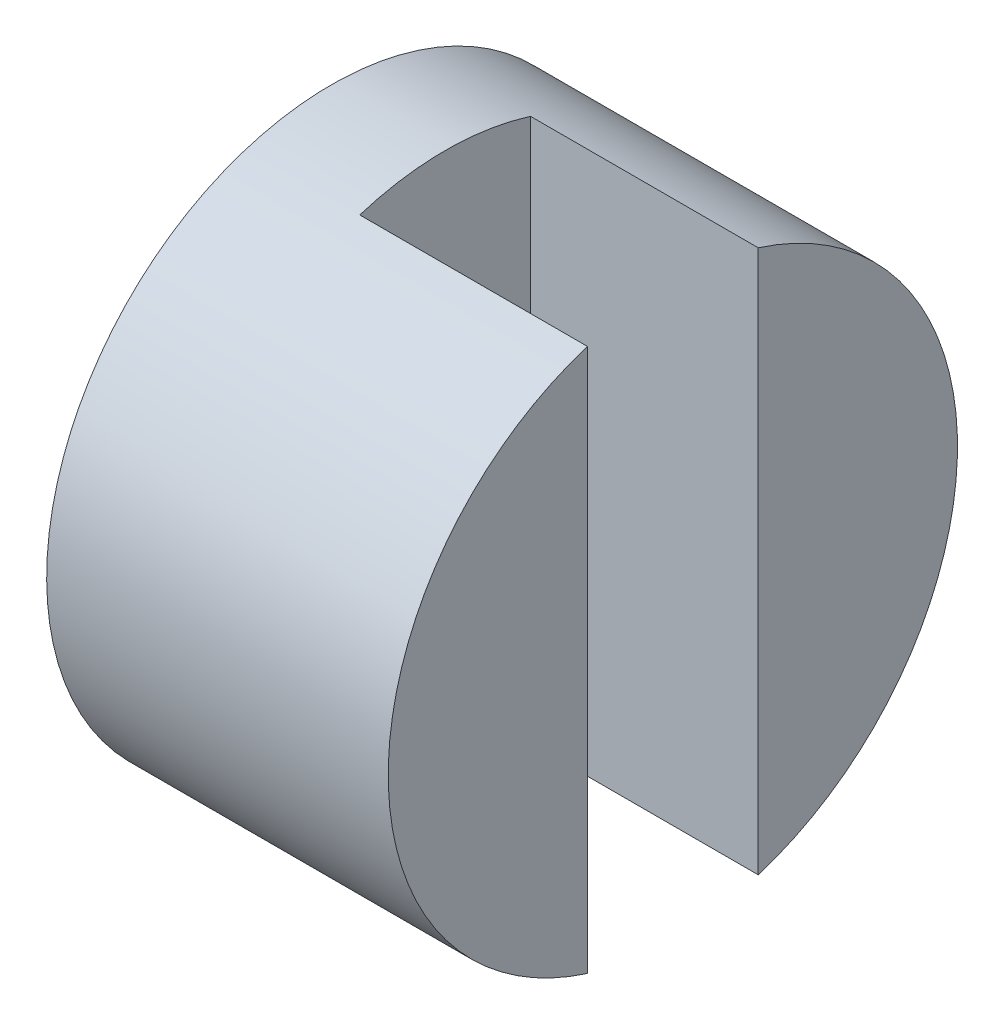
ISO-10303-21;
HEADER;
FILE_DESCRIPTION(('STEP AP214'),'2;1');
FILE_NAME('part.step','',(''),(''),'','','');
FILE_SCHEMA(('AUTOMOTIVE_DESIGN { 1 0 10303 214 1 1 1 1 }'));
ENDSEC;
DATA;
#1=APPLICATION_CONTEXT('core data for automotive mechanical design processes');
#2=APPLICATION_PROTOCOL_DEFINITION('international standard','automotive_design',2000,#1);
#3=PRODUCT_CONTEXT('',#1,'mechanical');
#4=PRODUCT('Part','Part','',(#3));
#5=PRODUCT_RELATED_PRODUCT_CATEGORY('part','',(#4));
#6=PRODUCT_DEFINITION_FORMATION('','',#4);
#7=PRODUCT_DEFINITION_CONTEXT('part definition',#1,'design');
#8=PRODUCT_DEFINITION('design','',#6,#7);
#9=PRODUCT_DEFINITION_SHAPE('','',#8);
#10=(LENGTH_UNIT() NAMED_UNIT(*) SI_UNIT(.MILLI.,.METRE.));
#11=(NAMED_UNIT(*) PLANE_ANGLE_UNIT() SI_UNIT($,.RADIAN.));
#12=(NAMED_UNIT(*) SI_UNIT($,.STERADIAN.) SOLID_ANGLE_UNIT());
#13=UNCERTAINTY_MEASURE_WITH_UNIT(LENGTH_MEASURE(1.E-05),#10,'distance_accuracy_value','');
#14=(GEOMETRIC_REPRESENTATION_CONTEXT(3) GLOBAL_UNCERTAINTY_ASSIGNED_CONTEXT((#13)) GLOBAL_UNIT_ASSIGNED_CONTEXT((#10,
#11,#12)) REPRESENTATION_CONTEXT('',''));
#15=CARTESIAN_POINT('',(0.,0.,0.));
#16=DIRECTION('',(0.,0.,1.));
#17=DIRECTION('',(1.,0.,0.));
#18=AXIS2_PLACEMENT_3D('',#15,#16,#17);
#19=CARTESIAN_POINT('',(6.,0.,0.));
#20=DIRECTION('',(1.,0.,0.));
#21=DIRECTION('',(0.,0.,-1.));
#22=AXIS2_PLACEMENT_3D('',#19,#20,#21);
#23=PLANE('',#22);
#24=DIRECTION('',(0.,1.,0.));
#25=VECTOR('',#24,1.);
#26=CARTESIAN_POINT('',(6.,4.76969600708473,-1.5));
#27=LINE('',#26,#25);
#28=CARTESIAN_POINT('',(6.,-4.76969600708473,-1.5));
#29=VERTEX_POINT('',#28);
#30=CARTESIAN_POINT('',(6.,4.76969600708473,-1.5));
#31=VERTEX_POINT('',#30);
#32=EDGE_CURVE('E72',#29,#31,#27,.T.);
#33=ORIENTED_EDGE('',*,*,#32,.F.);
#34=CARTESIAN_POINT('',(6.,0.,0.));
#35=DIRECTION('',(1.,0.,0.));
#36=DIRECTION('',(0.,0.,-1.));
#37=AXIS2_PLACEMENT_3D('',#34,#35,#36);
#38=CIRCLE('',#37,5.);
#39=EDGE_CURVE('E42',#29,#31,#38,.T.);
#40=ORIENTED_EDGE('',*,*,#39,.T.);
#41=EDGE_LOOP('',(#33,#40));
#42=FACE_BOUND('',#41,.T.);
#43=ADVANCED_FACE('F33',(#42),#23,.T.);
#44=CARTESIAN_POINT('',(6.,0.,0.));
#45=DIRECTION('',(-1.,0.,0.));
#46=DIRECTION('',(0.,0.,1.));
#47=AXIS2_PLACEMENT_3D('',#44,#45,#46);
#48=CYLINDRICAL_SURFACE('',#47,5.);
#49=CARTESIAN_POINT('',(2.,0.,0.));
#50=DIRECTION('',(1.,0.,0.));
#51=DIRECTION('',(0.,0.,-1.));
#52=AXIS2_PLACEMENT_3D('',#49,#50,#51);
#53=CIRCLE('',#52,5.);
#54=CARTESIAN_POINT('',(2.,4.76969600708473,-1.5));
#55=VERTEX_POINT('',#54);
#56=CARTESIAN_POINT('',(2.,4.76969600708473,1.5));
#57=VERTEX_POINT('',#56);
#58=EDGE_CURVE('E91',#55,#57,#53,.T.);
#59=ORIENTED_EDGE('',*,*,#58,.F.);
#60=DIRECTION('',(1.,0.,0.));
#61=VECTOR('',#60,1.);
#62=CARTESIAN_POINT('',(2.,4.76969600708473,-1.5));
#63=LINE('',#62,#61);
#64=EDGE_CURVE('E58',#55,#31,#63,.T.);
#65=ORIENTED_EDGE('',*,*,#64,.T.);
#66=ORIENTED_EDGE('',*,*,#39,.F.);
#67=DIRECTION('',(1.,0.,0.));
#68=VECTOR('',#67,1.);
#69=CARTESIAN_POINT('',(2.,-4.76969600708473,-1.5));
#70=LINE('',#69,#68);
#71=CARTESIAN_POINT('',(2.,-4.76969600708473,-1.5));
#72=VERTEX_POINT('',#71);
#73=EDGE_CURVE('E85',#72,#29,#70,.T.);
#74=ORIENTED_EDGE('',*,*,#73,.F.);
#75=CARTESIAN_POINT('',(2.,0.,0.));
#76=DIRECTION('',(1.,0.,0.));
#77=DIRECTION('',(0.,0.,-1.));
#78=AXIS2_PLACEMENT_3D('',#75,#76,#77);
#79=CIRCLE('',#78,5.);
#80=CARTESIAN_POINT('',(2.,-4.76969600708473,1.5));
#81=VERTEX_POINT('',#80);
#82=EDGE_CURVE('E89',#81,#72,#79,.T.);
#83=ORIENTED_EDGE('',*,*,#82,.F.);
#84=DIRECTION('',(1.,0.,0.));
#85=VECTOR('',#84,1.);
#86=CARTESIAN_POINT('',(2.,-4.76969600708473,1.5));
#87=LINE('',#86,#85);
#88=CARTESIAN_POINT('',(6.,-4.76969600708473,1.5));
#89=VERTEX_POINT('',#88);
#90=EDGE_CURVE('E79',#81,#89,#87,.T.);
#91=ORIENTED_EDGE('',*,*,#90,.T.);
#92=CARTESIAN_POINT('',(6.,4.76969600708473,1.5));
#93=VERTEX_POINT('',#92);
#94=EDGE_CURVE('E11',#93,#89,#38,.T.);
#95=ORIENTED_EDGE('',*,*,#94,.F.);
#96=DIRECTION('',(1.,0.,0.));
#97=VECTOR('',#96,1.);
#98=CARTESIAN_POINT('',(2.,4.76969600708473,1.5));
#99=LINE('',#98,#97);
#100=EDGE_CURVE('E49',#57,#93,#99,.T.);
#101=ORIENTED_EDGE('',*,*,#100,.F.);
#102=EDGE_LOOP('',(#59,#65,#66,#74,#83,#91,#95,#101));
#103=FACE_BOUND('',#102,.T.);
#104=CARTESIAN_POINT('',(0.,0.,0.));
#105=DIRECTION('',(1.,0.,0.));
#106=DIRECTION('',(0.,0.,-1.));
#107=AXIS2_PLACEMENT_3D('',#104,#105,#106);
#108=CIRCLE('',#107,5.);
#109=CARTESIAN_POINT('',(0.,0.,-5.));
#110=VERTEX_POINT('',#109);
#111=EDGE_CURVE('E37',#110,#110,#108,.T.);
#112=ORIENTED_EDGE('',*,*,#111,.T.);
#113=EDGE_LOOP('',(#112));
#114=FACE_BOUND('',#113,.T.);
#115=ADVANCED_FACE('F35',(#103,#114),#48,.T.);
#116=DIRECTION('',(0.,-1.,0.));
#117=VECTOR('',#116,1.);
#118=CARTESIAN_POINT('',(6.,4.76969600708473,1.5));
#119=LINE('',#118,#117);
#120=EDGE_CURVE('E81',#93,#89,#119,.T.);
#121=ORIENTED_EDGE('',*,*,#120,.F.);
#122=ORIENTED_EDGE('',*,*,#94,.T.);
#123=EDGE_LOOP('',(#121,#122));
#124=FACE_BOUND('',#123,.T.);
#125=ADVANCED_FACE('F113',(#124),#23,.T.);
#126=CARTESIAN_POINT('',(0.,0.,0.));
#127=DIRECTION('',(1.,0.,0.));
#128=DIRECTION('',(0.,0.,-1.));
#129=AXIS2_PLACEMENT_3D('',#126,#127,#128);
#130=PLANE('',#129);
#131=ORIENTED_EDGE('',*,*,#111,.F.);
#132=EDGE_LOOP('',(#131));
#133=FACE_BOUND('',#132,.T.);
#134=ADVANCED_FACE('F110',(#133),#130,.F.);
#135=CARTESIAN_POINT('',(2.,4.76969600708473,-1.5));
#136=DIRECTION('',(0.,0.,-1.));
#137=DIRECTION('',(-1.,0.,0.));
#138=AXIS2_PLACEMENT_3D('',#135,#136,#137);
#139=PLANE('',#138);
#140=ORIENTED_EDGE('',*,*,#32,.T.);
#141=ORIENTED_EDGE('',*,*,#64,.F.);
#142=DIRECTION('',(0.,1.,0.));
#143=VECTOR('',#142,1.);
#144=CARTESIAN_POINT('',(2.,4.76969600708473,-1.5));
#145=LINE('',#144,#143);
#146=EDGE_CURVE('E96',#72,#55,#145,.T.);
#147=ORIENTED_EDGE('',*,*,#146,.F.);
#148=ORIENTED_EDGE('',*,*,#73,.T.);
#149=EDGE_LOOP('',(#140,#141,#147,#148));
#150=FACE_BOUND('',#149,.T.);
#151=ADVANCED_FACE('F112',(#150),#139,.F.);
#152=CARTESIAN_POINT('',(2.,4.76969600708473,1.5));
#153=DIRECTION('',(0.,0.,1.));
#154=DIRECTION('',(1.,0.,0.));
#155=AXIS2_PLACEMENT_3D('',#152,#153,#154);
#156=PLANE('',#155);
#157=ORIENTED_EDGE('',*,*,#120,.T.);
#158=ORIENTED_EDGE('',*,*,#90,.F.);
#159=DIRECTION('',(0.,-1.,0.));
#160=VECTOR('',#159,1.);
#161=CARTESIAN_POINT('',(2.,4.76969600708473,1.5));
#162=LINE('',#161,#160);
#163=EDGE_CURVE('E76',#57,#81,#162,.T.);
#164=ORIENTED_EDGE('',*,*,#163,.F.);
#165=ORIENTED_EDGE('',*,*,#100,.T.);
#166=EDGE_LOOP('',(#157,#158,#164,#165));
#167=FACE_BOUND('',#166,.T.);
#168=ADVANCED_FACE('F80',(#167),#156,.F.);
#169=CARTESIAN_POINT('',(2.,0.,0.));
#170=DIRECTION('',(1.,0.,0.));
#171=DIRECTION('',(0.,0.,-1.));
#172=AXIS2_PLACEMENT_3D('',#169,#170,#171);
#173=PLANE('',#172);
#174=ORIENTED_EDGE('',*,*,#58,.T.);
#175=ORIENTED_EDGE('',*,*,#163,.T.);
#176=ORIENTED_EDGE('',*,*,#82,.T.);
#177=ORIENTED_EDGE('',*,*,#146,.T.);
#178=EDGE_LOOP('',(#174,#175,#176,#177));
#179=FACE_BOUND('',#178,.T.);
#180=ADVANCED_FACE('F88',(#179),#173,.T.);
#181=CLOSED_SHELL('',(#43,#115,#125,#134,#151,#168,#180));
#182=MANIFOLD_SOLID_BREP('B2',#181);
#183=ADVANCED_BREP_SHAPE_REPRESENTATION('',(#18,#182),#14);
#184=SHAPE_DEFINITION_REPRESENTATION(#9,#183);
ENDSEC;
END-ISO-10303-21;
